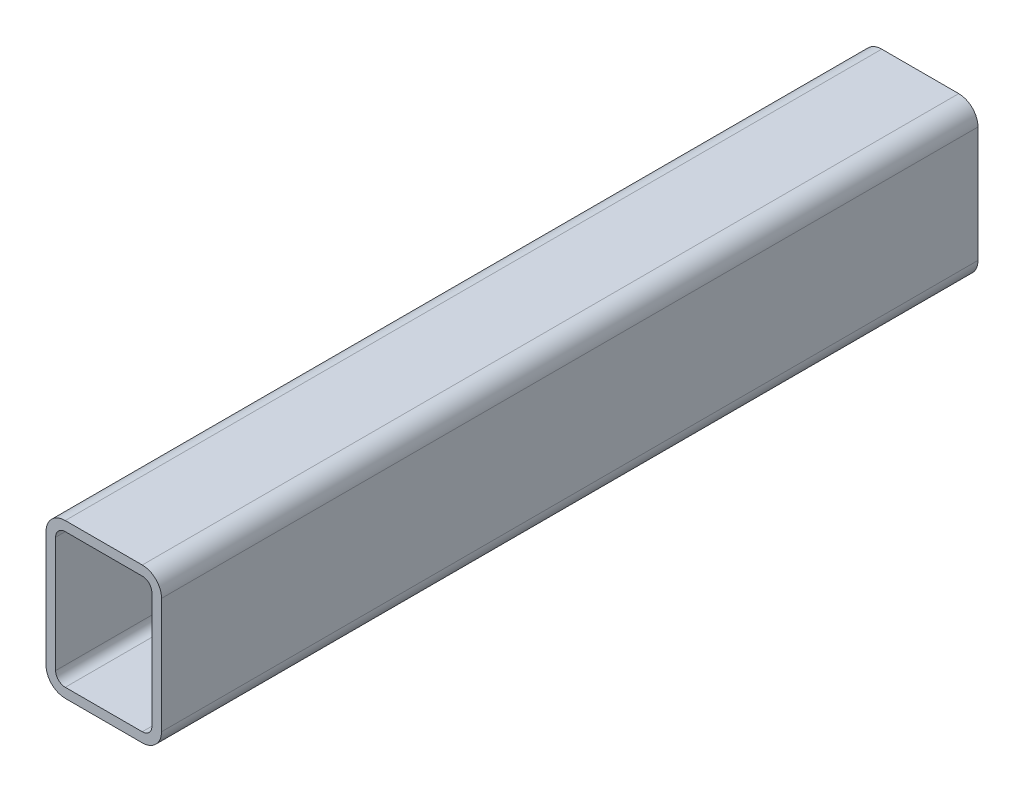
ISO-10303-21;
HEADER;
FILE_DESCRIPTION(('STEP AP214'),'2;1');
FILE_NAME('part.step','',(''),(''),'','','');
FILE_SCHEMA(('AUTOMOTIVE_DESIGN { 1 0 10303 214 1 1 1 1 }'));
ENDSEC;
DATA;
#1=APPLICATION_CONTEXT('core data for automotive mechanical design processes');
#2=APPLICATION_PROTOCOL_DEFINITION('international standard','automotive_design',2000,#1);
#3=PRODUCT_CONTEXT('',#1,'mechanical');
#4=PRODUCT('Part','Part','',(#3));
#5=PRODUCT_RELATED_PRODUCT_CATEGORY('part','',(#4));
#6=PRODUCT_DEFINITION_FORMATION('','',#4);
#7=PRODUCT_DEFINITION_CONTEXT('part definition',#1,'design');
#8=PRODUCT_DEFINITION('design','',#6,#7);
#9=PRODUCT_DEFINITION_SHAPE('','',#8);
#10=(LENGTH_UNIT() NAMED_UNIT(*) SI_UNIT(.MILLI.,.METRE.));
#11=(NAMED_UNIT(*) PLANE_ANGLE_UNIT() SI_UNIT($,.RADIAN.));
#12=(NAMED_UNIT(*) SI_UNIT($,.STERADIAN.) SOLID_ANGLE_UNIT());
#13=UNCERTAINTY_MEASURE_WITH_UNIT(LENGTH_MEASURE(1.E-05),#10,'distance_accuracy_value','');
#14=(GEOMETRIC_REPRESENTATION_CONTEXT(3) GLOBAL_UNCERTAINTY_ASSIGNED_CONTEXT((#13)) GLOBAL_UNIT_ASSIGNED_CONTEXT((#10,
#11,#12)) REPRESENTATION_CONTEXT('',''));
#15=CARTESIAN_POINT('',(0.,0.,0.));
#16=DIRECTION('',(0.,0.,1.));
#17=DIRECTION('',(1.,0.,0.));
#18=AXIS2_PLACEMENT_3D('',#15,#16,#17);
#19=CARTESIAN_POINT('',(-20.,-30.,212.));
#20=DIRECTION('',(0.,0.,1.));
#21=DIRECTION('',(1.,0.,0.));
#22=AXIS2_PLACEMENT_3D('',#19,#20,#21);
#23=PLANE('',#22);
#24=CARTESIAN_POINT('',(-20.,-30.,212.));
#25=DIRECTION('',(0.,0.,1.));
#26=DIRECTION('',(1.,0.,0.));
#27=AXIS2_PLACEMENT_3D('',#24,#25,#26);
#28=CIRCLE('',#27,10.);
#29=CARTESIAN_POINT('',(-30.,-30.,212.));
#30=VERTEX_POINT('',#29);
#31=CARTESIAN_POINT('',(-20.,-40.,212.));
#32=VERTEX_POINT('',#31);
#33=EDGE_CURVE('E210',#30,#32,#28,.T.);
#34=ORIENTED_EDGE('',*,*,#33,.T.);
#35=DIRECTION('',(1.,0.,0.));
#36=VECTOR('',#35,1.);
#37=CARTESIAN_POINT('',(-20.,-40.,212.));
#38=LINE('',#37,#36);
#39=CARTESIAN_POINT('',(20.,-40.,212.));
#40=VERTEX_POINT('',#39);
#41=EDGE_CURVE('E213',#32,#40,#38,.T.);
#42=ORIENTED_EDGE('',*,*,#41,.T.);
#43=CARTESIAN_POINT('',(20.,-30.,212.));
#44=DIRECTION('',(0.,0.,1.));
#45=DIRECTION('',(1.,0.,0.));
#46=AXIS2_PLACEMENT_3D('',#43,#44,#45);
#47=CIRCLE('',#46,10.);
#48=CARTESIAN_POINT('',(30.,-30.,212.));
#49=VERTEX_POINT('',#48);
#50=EDGE_CURVE('E216',#40,#49,#47,.T.);
#51=ORIENTED_EDGE('',*,*,#50,.T.);
#52=DIRECTION('',(0.,1.,0.));
#53=VECTOR('',#52,1.);
#54=CARTESIAN_POINT('',(30.,30.,212.));
#55=LINE('',#54,#53);
#56=CARTESIAN_POINT('',(30.,30.,212.));
#57=VERTEX_POINT('',#56);
#58=EDGE_CURVE('E218',#49,#57,#55,.T.);
#59=ORIENTED_EDGE('',*,*,#58,.T.);
#60=CARTESIAN_POINT('',(20.,30.,212.));
#61=DIRECTION('',(0.,0.,1.));
#62=DIRECTION('',(-1.,0.,0.));
#63=AXIS2_PLACEMENT_3D('',#60,#61,#62);
#64=CIRCLE('',#63,10.);
#65=CARTESIAN_POINT('',(20.,40.,212.));
#66=VERTEX_POINT('',#65);
#67=EDGE_CURVE('E220',#57,#66,#64,.T.);
#68=ORIENTED_EDGE('',*,*,#67,.T.);
#69=DIRECTION('',(-1.,0.,0.));
#70=VECTOR('',#69,1.);
#71=CARTESIAN_POINT('',(-20.,40.,212.));
#72=LINE('',#71,#70);
#73=CARTESIAN_POINT('',(-20.,40.,212.));
#74=VERTEX_POINT('',#73);
#75=EDGE_CURVE('E222',#66,#74,#72,.T.);
#76=ORIENTED_EDGE('',*,*,#75,.T.);
#77=CARTESIAN_POINT('',(-20.,30.,212.));
#78=DIRECTION('',(0.,0.,1.));
#79=DIRECTION('',(1.,0.,0.));
#80=AXIS2_PLACEMENT_3D('',#77,#78,#79);
#81=CIRCLE('',#80,10.);
#82=CARTESIAN_POINT('',(-30.,30.,212.));
#83=VERTEX_POINT('',#82);
#84=EDGE_CURVE('E224',#74,#83,#81,.T.);
#85=ORIENTED_EDGE('',*,*,#84,.T.);
#86=DIRECTION('',(0.,-1.,0.));
#87=VECTOR('',#86,1.);
#88=CARTESIAN_POINT('',(-30.,30.,212.));
#89=LINE('',#88,#87);
#90=EDGE_CURVE('E226',#83,#30,#89,.T.);
#91=ORIENTED_EDGE('',*,*,#90,.T.);
#92=EDGE_LOOP('',(#34,#42,#51,#59,#68,#76,#85,#91));
#93=FACE_BOUND('',#92,.T.);
#94=DIRECTION('',(1.,0.,0.));
#95=VECTOR('',#94,1.);
#96=CARTESIAN_POINT('',(-20.,-35.,212.));
#97=LINE('',#96,#95);
#98=CARTESIAN_POINT('',(-20.,-35.,212.));
#99=VERTEX_POINT('',#98);
#100=CARTESIAN_POINT('',(20.,-35.,212.));
#101=VERTEX_POINT('',#100);
#102=EDGE_CURVE('E153',#99,#101,#97,.T.);
#103=ORIENTED_EDGE('',*,*,#102,.F.);
#104=CARTESIAN_POINT('',(-20.,-30.,212.));
#105=DIRECTION('',(0.,0.,1.));
#106=DIRECTION('',(-1.,0.,0.));
#107=AXIS2_PLACEMENT_3D('',#104,#105,#106);
#108=CIRCLE('',#107,4.99999999999998);
#109=CARTESIAN_POINT('',(-25.,-30.,212.));
#110=VERTEX_POINT('',#109);
#111=EDGE_CURVE('E145',#110,#99,#108,.T.);
#112=ORIENTED_EDGE('',*,*,#111,.F.);
#113=DIRECTION('',(0.,-1.,0.));
#114=VECTOR('',#113,1.);
#115=CARTESIAN_POINT('',(-25.,30.,212.));
#116=LINE('',#115,#114);
#117=CARTESIAN_POINT('',(-25.,30.,212.));
#118=VERTEX_POINT('',#117);
#119=EDGE_CURVE('E178',#118,#110,#116,.T.);
#120=ORIENTED_EDGE('',*,*,#119,.F.);
#121=CARTESIAN_POINT('',(-20.,30.,212.));
#122=DIRECTION('',(0.,0.,1.));
#123=DIRECTION('',(1.,0.,0.));
#124=AXIS2_PLACEMENT_3D('',#121,#122,#123);
#125=CIRCLE('',#124,4.99999999999997);
#126=CARTESIAN_POINT('',(-20.,35.,212.));
#127=VERTEX_POINT('',#126);
#128=EDGE_CURVE('E176',#127,#118,#125,.T.);
#129=ORIENTED_EDGE('',*,*,#128,.F.);
#130=DIRECTION('',(-1.,0.,0.));
#131=VECTOR('',#130,1.);
#132=CARTESIAN_POINT('',(-20.,35.,212.));
#133=LINE('',#132,#131);
#134=CARTESIAN_POINT('',(20.,35.,212.));
#135=VERTEX_POINT('',#134);
#136=EDGE_CURVE('E174',#135,#127,#133,.T.);
#137=ORIENTED_EDGE('',*,*,#136,.F.);
#138=CARTESIAN_POINT('',(20.,30.,212.));
#139=DIRECTION('',(0.,0.,1.));
#140=DIRECTION('',(-1.,0.,0.));
#141=AXIS2_PLACEMENT_3D('',#138,#139,#140);
#142=CIRCLE('',#141,4.99999999999998);
#143=CARTESIAN_POINT('',(25.,30.,212.));
#144=VERTEX_POINT('',#143);
#145=EDGE_CURVE('E172',#144,#135,#142,.T.);
#146=ORIENTED_EDGE('',*,*,#145,.F.);
#147=DIRECTION('',(0.,1.,0.));
#148=VECTOR('',#147,1.);
#149=CARTESIAN_POINT('',(25.,30.,212.));
#150=LINE('',#149,#148);
#151=CARTESIAN_POINT('',(25.,-30.,212.));
#152=VERTEX_POINT('',#151);
#153=EDGE_CURVE('E168',#152,#144,#150,.T.);
#154=ORIENTED_EDGE('',*,*,#153,.F.);
#155=CARTESIAN_POINT('',(20.,-30.,212.));
#156=DIRECTION('',(0.,0.,1.));
#157=DIRECTION('',(-1.,0.,0.));
#158=AXIS2_PLACEMENT_3D('',#155,#156,#157);
#159=CIRCLE('',#158,4.99999999999998);
#160=EDGE_CURVE('E166',#101,#152,#159,.T.);
#161=ORIENTED_EDGE('',*,*,#160,.F.);
#162=EDGE_LOOP('',(#103,#112,#120,#129,#137,#146,#154,#161));
#163=FACE_BOUND('',#162,.T.);
#164=ADVANCED_FACE('F32',(#93,#163),#23,.T.);
#165=CARTESIAN_POINT('',(-20.,-30.,-212.));
#166=DIRECTION('',(0.,0.,1.));
#167=DIRECTION('',(1.,0.,0.));
#168=AXIS2_PLACEMENT_3D('',#165,#166,#167);
#169=PLANE('',#168);
#170=CARTESIAN_POINT('',(-20.,-30.,-212.));
#171=DIRECTION('',(0.,0.,1.));
#172=DIRECTION('',(1.,0.,0.));
#173=AXIS2_PLACEMENT_3D('',#170,#171,#172);
#174=CIRCLE('',#173,10.);
#175=CARTESIAN_POINT('',(-30.,-30.,-212.));
#176=VERTEX_POINT('',#175);
#177=CARTESIAN_POINT('',(-20.,-40.,-212.));
#178=VERTEX_POINT('',#177);
#179=EDGE_CURVE('E161',#176,#178,#174,.T.);
#180=ORIENTED_EDGE('',*,*,#179,.F.);
#181=DIRECTION('',(0.,-1.,0.));
#182=VECTOR('',#181,1.);
#183=CARTESIAN_POINT('',(-30.,30.,-212.));
#184=LINE('',#183,#182);
#185=CARTESIAN_POINT('',(-30.,30.,-212.));
#186=VERTEX_POINT('',#185);
#187=EDGE_CURVE('E214',#186,#176,#184,.T.);
#188=ORIENTED_EDGE('',*,*,#187,.F.);
#189=CARTESIAN_POINT('',(-20.,30.,-212.));
#190=DIRECTION('',(0.,0.,1.));
#191=DIRECTION('',(1.,0.,0.));
#192=AXIS2_PLACEMENT_3D('',#189,#190,#191);
#193=CIRCLE('',#192,10.);
#194=CARTESIAN_POINT('',(-20.,40.,-212.));
#195=VERTEX_POINT('',#194);
#196=EDGE_CURVE('E241',#195,#186,#193,.T.);
#197=ORIENTED_EDGE('',*,*,#196,.F.);
#198=DIRECTION('',(-1.,0.,0.));
#199=VECTOR('',#198,1.);
#200=CARTESIAN_POINT('',(-20.,40.,-212.));
#201=LINE('',#200,#199);
#202=CARTESIAN_POINT('',(20.,40.,-212.));
#203=VERTEX_POINT('',#202);
#204=EDGE_CURVE('E239',#203,#195,#201,.T.);
#205=ORIENTED_EDGE('',*,*,#204,.F.);
#206=CARTESIAN_POINT('',(20.,30.,-212.));
#207=DIRECTION('',(0.,0.,1.));
#208=DIRECTION('',(-1.,0.,0.));
#209=AXIS2_PLACEMENT_3D('',#206,#207,#208);
#210=CIRCLE('',#209,10.);
#211=CARTESIAN_POINT('',(30.,30.,-212.));
#212=VERTEX_POINT('',#211);
#213=EDGE_CURVE('E237',#212,#203,#210,.T.);
#214=ORIENTED_EDGE('',*,*,#213,.F.);
#215=DIRECTION('',(0.,1.,0.));
#216=VECTOR('',#215,1.);
#217=CARTESIAN_POINT('',(30.,30.,-212.));
#218=LINE('',#217,#216);
#219=CARTESIAN_POINT('',(30.,-30.,-212.));
#220=VERTEX_POINT('',#219);
#221=EDGE_CURVE('E235',#220,#212,#218,.T.);
#222=ORIENTED_EDGE('',*,*,#221,.F.);
#223=CARTESIAN_POINT('',(20.,-30.,-212.));
#224=DIRECTION('',(0.,0.,1.));
#225=DIRECTION('',(1.,0.,0.));
#226=AXIS2_PLACEMENT_3D('',#223,#224,#225);
#227=CIRCLE('',#226,10.);
#228=CARTESIAN_POINT('',(20.,-40.,-212.));
#229=VERTEX_POINT('',#228);
#230=EDGE_CURVE('E233',#229,#220,#227,.T.);
#231=ORIENTED_EDGE('',*,*,#230,.F.);
#232=DIRECTION('',(1.,0.,0.));
#233=VECTOR('',#232,1.);
#234=CARTESIAN_POINT('',(-20.,-40.,-212.));
#235=LINE('',#234,#233);
#236=EDGE_CURVE('E231',#178,#229,#235,.T.);
#237=ORIENTED_EDGE('',*,*,#236,.F.);
#238=EDGE_LOOP('',(#180,#188,#197,#205,#214,#222,#231,#237));
#239=FACE_BOUND('',#238,.T.);
#240=CARTESIAN_POINT('',(-20.,-30.,-212.));
#241=DIRECTION('',(0.,0.,1.));
#242=DIRECTION('',(-1.,0.,0.));
#243=AXIS2_PLACEMENT_3D('',#240,#241,#242);
#244=CIRCLE('',#243,4.99999999999998);
#245=CARTESIAN_POINT('',(-25.,-30.,-212.));
#246=VERTEX_POINT('',#245);
#247=CARTESIAN_POINT('',(-20.,-35.,-212.));
#248=VERTEX_POINT('',#247);
#249=EDGE_CURVE('E55',#246,#248,#244,.T.);
#250=ORIENTED_EDGE('',*,*,#249,.T.);
#251=DIRECTION('',(1.,0.,0.));
#252=VECTOR('',#251,1.);
#253=CARTESIAN_POINT('',(-20.,-35.,-212.));
#254=LINE('',#253,#252);
#255=CARTESIAN_POINT('',(20.,-35.,-212.));
#256=VERTEX_POINT('',#255);
#257=EDGE_CURVE('E160',#248,#256,#254,.T.);
#258=ORIENTED_EDGE('',*,*,#257,.T.);
#259=CARTESIAN_POINT('',(20.,-30.,-212.));
#260=DIRECTION('',(0.,0.,1.));
#261=DIRECTION('',(-1.,0.,0.));
#262=AXIS2_PLACEMENT_3D('',#259,#260,#261);
#263=CIRCLE('',#262,4.99999999999998);
#264=CARTESIAN_POINT('',(25.,-30.,-212.));
#265=VERTEX_POINT('',#264);
#266=EDGE_CURVE('E182',#256,#265,#263,.T.);
#267=ORIENTED_EDGE('',*,*,#266,.T.);
#268=DIRECTION('',(0.,1.,0.));
#269=VECTOR('',#268,1.);
#270=CARTESIAN_POINT('',(25.,30.,-212.));
#271=LINE('',#270,#269);
#272=CARTESIAN_POINT('',(25.,30.,-212.));
#273=VERTEX_POINT('',#272);
#274=EDGE_CURVE('E185',#265,#273,#271,.T.);
#275=ORIENTED_EDGE('',*,*,#274,.T.);
#276=CARTESIAN_POINT('',(20.,30.,-212.));
#277=DIRECTION('',(0.,0.,1.));
#278=DIRECTION('',(-1.,0.,0.));
#279=AXIS2_PLACEMENT_3D('',#276,#277,#278);
#280=CIRCLE('',#279,4.99999999999998);
#281=CARTESIAN_POINT('',(20.,35.,-212.));
#282=VERTEX_POINT('',#281);
#283=EDGE_CURVE('E188',#273,#282,#280,.T.);
#284=ORIENTED_EDGE('',*,*,#283,.T.);
#285=DIRECTION('',(-1.,0.,0.));
#286=VECTOR('',#285,1.);
#287=CARTESIAN_POINT('',(-20.,35.,-212.));
#288=LINE('',#287,#286);
#289=CARTESIAN_POINT('',(-20.,35.,-212.));
#290=VERTEX_POINT('',#289);
#291=EDGE_CURVE('E191',#282,#290,#288,.T.);
#292=ORIENTED_EDGE('',*,*,#291,.T.);
#293=CARTESIAN_POINT('',(-20.,30.,-212.));
#294=DIRECTION('',(0.,0.,1.));
#295=DIRECTION('',(1.,0.,0.));
#296=AXIS2_PLACEMENT_3D('',#293,#294,#295);
#297=CIRCLE('',#296,4.99999999999997);
#298=CARTESIAN_POINT('',(-25.,30.,-212.));
#299=VERTEX_POINT('',#298);
#300=EDGE_CURVE('E194',#290,#299,#297,.T.);
#301=ORIENTED_EDGE('',*,*,#300,.T.);
#302=DIRECTION('',(0.,-1.,0.));
#303=VECTOR('',#302,1.);
#304=CARTESIAN_POINT('',(-25.,30.,-212.));
#305=LINE('',#304,#303);
#306=EDGE_CURVE('E154',#299,#246,#305,.T.);
#307=ORIENTED_EDGE('',*,*,#306,.T.);
#308=EDGE_LOOP('',(#250,#258,#267,#275,#284,#292,#301,#307));
#309=FACE_BOUND('',#308,.T.);
#310=ADVANCED_FACE('F271',(#239,#309),#169,.F.);
#311=CARTESIAN_POINT('',(-20.,-30.,212.));
#312=DIRECTION('',(0.,0.,-1.));
#313=DIRECTION('',(-1.,0.,0.));
#314=AXIS2_PLACEMENT_3D('',#311,#312,#313);
#315=CYLINDRICAL_SURFACE('',#314,10.);
#316=ORIENTED_EDGE('',*,*,#179,.T.);
#317=DIRECTION('',(0.,0.,-1.));
#318=VECTOR('',#317,1.);
#319=CARTESIAN_POINT('',(-20.,-40.,212.));
#320=LINE('',#319,#318);
#321=EDGE_CURVE('E11',#32,#178,#320,.T.);
#322=ORIENTED_EDGE('',*,*,#321,.F.);
#323=ORIENTED_EDGE('',*,*,#33,.F.);
#324=DIRECTION('',(0.,0.,-1.));
#325=VECTOR('',#324,1.);
#326=CARTESIAN_POINT('',(-30.,-30.,212.));
#327=LINE('',#326,#325);
#328=EDGE_CURVE('E228',#30,#176,#327,.T.);
#329=ORIENTED_EDGE('',*,*,#328,.T.);
#330=EDGE_LOOP('',(#316,#322,#323,#329));
#331=FACE_BOUND('',#330,.T.);
#332=ADVANCED_FACE('F34',(#331),#315,.T.);
#333=CARTESIAN_POINT('',(-20.,-40.,212.));
#334=DIRECTION('',(0.,1.,0.));
#335=DIRECTION('',(-1.,0.,0.));
#336=AXIS2_PLACEMENT_3D('',#333,#334,#335);
#337=PLANE('',#336);
#338=ORIENTED_EDGE('',*,*,#236,.T.);
#339=DIRECTION('',(0.,0.,-1.));
#340=VECTOR('',#339,1.);
#341=CARTESIAN_POINT('',(20.,-40.,212.));
#342=LINE('',#341,#340);
#343=EDGE_CURVE('E40',#40,#229,#342,.T.);
#344=ORIENTED_EDGE('',*,*,#343,.F.);
#345=ORIENTED_EDGE('',*,*,#41,.F.);
#346=ORIENTED_EDGE('',*,*,#321,.T.);
#347=EDGE_LOOP('',(#338,#344,#345,#346));
#348=FACE_BOUND('',#347,.T.);
#349=ADVANCED_FACE('F288',(#348),#337,.F.);
#350=CARTESIAN_POINT('',(20.,-30.,212.));
#351=DIRECTION('',(0.,0.,-1.));
#352=DIRECTION('',(-1.,0.,0.));
#353=AXIS2_PLACEMENT_3D('',#350,#351,#352);
#354=CYLINDRICAL_SURFACE('',#353,10.);
#355=ORIENTED_EDGE('',*,*,#230,.T.);
#356=DIRECTION('',(0.,0.,-1.));
#357=VECTOR('',#356,1.);
#358=CARTESIAN_POINT('',(30.,-30.,212.));
#359=LINE('',#358,#357);
#360=EDGE_CURVE('E258',#49,#220,#359,.T.);
#361=ORIENTED_EDGE('',*,*,#360,.F.);
#362=ORIENTED_EDGE('',*,*,#50,.F.);
#363=ORIENTED_EDGE('',*,*,#343,.T.);
#364=EDGE_LOOP('',(#355,#361,#362,#363));
#365=FACE_BOUND('',#364,.T.);
#366=ADVANCED_FACE('F265',(#365),#354,.T.);
#367=CARTESIAN_POINT('',(30.,30.,212.));
#368=DIRECTION('',(-1.,0.,0.));
#369=DIRECTION('',(0.,0.,1.));
#370=AXIS2_PLACEMENT_3D('',#367,#368,#369);
#371=PLANE('',#370);
#372=ORIENTED_EDGE('',*,*,#221,.T.);
#373=DIRECTION('',(0.,0.,-1.));
#374=VECTOR('',#373,1.);
#375=CARTESIAN_POINT('',(30.,30.,212.));
#376=LINE('',#375,#374);
#377=EDGE_CURVE('E255',#57,#212,#376,.T.);
#378=ORIENTED_EDGE('',*,*,#377,.F.);
#379=ORIENTED_EDGE('',*,*,#58,.F.);
#380=ORIENTED_EDGE('',*,*,#360,.T.);
#381=EDGE_LOOP('',(#372,#378,#379,#380));
#382=FACE_BOUND('',#381,.T.);
#383=ADVANCED_FACE('F277',(#382),#371,.F.);
#384=CARTESIAN_POINT('',(20.,30.,212.));
#385=DIRECTION('',(0.,0.,-1.));
#386=DIRECTION('',(-1.,0.,0.));
#387=AXIS2_PLACEMENT_3D('',#384,#385,#386);
#388=CYLINDRICAL_SURFACE('',#387,10.);
#389=ORIENTED_EDGE('',*,*,#213,.T.);
#390=DIRECTION('',(0.,0.,-1.));
#391=VECTOR('',#390,1.);
#392=CARTESIAN_POINT('',(20.,40.,212.));
#393=LINE('',#392,#391);
#394=EDGE_CURVE('E252',#66,#203,#393,.T.);
#395=ORIENTED_EDGE('',*,*,#394,.F.);
#396=ORIENTED_EDGE('',*,*,#67,.F.);
#397=ORIENTED_EDGE('',*,*,#377,.T.);
#398=EDGE_LOOP('',(#389,#395,#396,#397));
#399=FACE_BOUND('',#398,.T.);
#400=ADVANCED_FACE('F281',(#399),#388,.T.);
#401=CARTESIAN_POINT('',(-20.,40.,212.));
#402=DIRECTION('',(0.,-1.,0.));
#403=DIRECTION('',(1.,0.,0.));
#404=AXIS2_PLACEMENT_3D('',#401,#402,#403);
#405=PLANE('',#404);
#406=ORIENTED_EDGE('',*,*,#204,.T.);
#407=DIRECTION('',(0.,0.,-1.));
#408=VECTOR('',#407,1.);
#409=CARTESIAN_POINT('',(-20.,40.,212.));
#410=LINE('',#409,#408);
#411=EDGE_CURVE('E249',#74,#195,#410,.T.);
#412=ORIENTED_EDGE('',*,*,#411,.F.);
#413=ORIENTED_EDGE('',*,*,#75,.F.);
#414=ORIENTED_EDGE('',*,*,#394,.T.);
#415=EDGE_LOOP('',(#406,#412,#413,#414));
#416=FACE_BOUND('',#415,.T.);
#417=ADVANCED_FACE('F301',(#416),#405,.F.);
#418=CARTESIAN_POINT('',(-20.,30.,212.));
#419=DIRECTION('',(0.,0.,-1.));
#420=DIRECTION('',(-1.,0.,0.));
#421=AXIS2_PLACEMENT_3D('',#418,#419,#420);
#422=CYLINDRICAL_SURFACE('',#421,10.);
#423=ORIENTED_EDGE('',*,*,#196,.T.);
#424=DIRECTION('',(0.,0.,-1.));
#425=VECTOR('',#424,1.);
#426=CARTESIAN_POINT('',(-30.,30.,212.));
#427=LINE('',#426,#425);
#428=EDGE_CURVE('E246',#83,#186,#427,.T.);
#429=ORIENTED_EDGE('',*,*,#428,.F.);
#430=ORIENTED_EDGE('',*,*,#84,.F.);
#431=ORIENTED_EDGE('',*,*,#411,.T.);
#432=EDGE_LOOP('',(#423,#429,#430,#431));
#433=FACE_BOUND('',#432,.T.);
#434=ADVANCED_FACE('F299',(#433),#422,.T.);
#435=CARTESIAN_POINT('',(-30.,30.,212.));
#436=DIRECTION('',(1.,0.,0.));
#437=DIRECTION('',(0.,1.,0.));
#438=AXIS2_PLACEMENT_3D('',#435,#436,#437);
#439=PLANE('',#438);
#440=ORIENTED_EDGE('',*,*,#187,.T.);
#441=ORIENTED_EDGE('',*,*,#328,.F.);
#442=ORIENTED_EDGE('',*,*,#90,.F.);
#443=ORIENTED_EDGE('',*,*,#428,.T.);
#444=EDGE_LOOP('',(#440,#441,#442,#443));
#445=FACE_BOUND('',#444,.T.);
#446=ADVANCED_FACE('F294',(#445),#439,.F.);
#447=CARTESIAN_POINT('',(-20.,-30.,212.));
#448=DIRECTION('',(0.,0.,-1.));
#449=DIRECTION('',(-1.,0.,0.));
#450=AXIS2_PLACEMENT_3D('',#447,#448,#449);
#451=CYLINDRICAL_SURFACE('',#450,4.99999999999998);
#452=ORIENTED_EDGE('',*,*,#249,.F.);
#453=DIRECTION('',(0.,0.,-1.));
#454=VECTOR('',#453,1.);
#455=CARTESIAN_POINT('',(-25.,-30.,212.));
#456=LINE('',#455,#454);
#457=EDGE_CURVE('E149',#110,#246,#456,.T.);
#458=ORIENTED_EDGE('',*,*,#457,.F.);
#459=ORIENTED_EDGE('',*,*,#111,.T.);
#460=DIRECTION('',(0.,0.,-1.));
#461=VECTOR('',#460,1.);
#462=CARTESIAN_POINT('',(-20.,-35.,212.));
#463=LINE('',#462,#461);
#464=EDGE_CURVE('E148',#99,#248,#463,.T.);
#465=ORIENTED_EDGE('',*,*,#464,.T.);
#466=EDGE_LOOP('',(#452,#458,#459,#465));
#467=FACE_BOUND('',#466,.T.);
#468=ADVANCED_FACE('F147',(#467),#451,.F.);
#469=CARTESIAN_POINT('',(-20.,-35.,212.));
#470=DIRECTION('',(0.,1.,0.));
#471=DIRECTION('',(-1.,0.,0.));
#472=AXIS2_PLACEMENT_3D('',#469,#470,#471);
#473=PLANE('',#472);
#474=ORIENTED_EDGE('',*,*,#257,.F.);
#475=ORIENTED_EDGE('',*,*,#464,.F.);
#476=ORIENTED_EDGE('',*,*,#102,.T.);
#477=DIRECTION('',(0.,0.,-1.));
#478=VECTOR('',#477,1.);
#479=CARTESIAN_POINT('',(20.,-35.,212.));
#480=LINE('',#479,#478);
#481=EDGE_CURVE('E162',#101,#256,#480,.T.);
#482=ORIENTED_EDGE('',*,*,#481,.T.);
#483=EDGE_LOOP('',(#474,#475,#476,#482));
#484=FACE_BOUND('',#483,.T.);
#485=ADVANCED_FACE('F157',(#484),#473,.T.);
#486=CARTESIAN_POINT('',(20.,-30.,212.));
#487=DIRECTION('',(0.,0.,-1.));
#488=DIRECTION('',(-1.,0.,0.));
#489=AXIS2_PLACEMENT_3D('',#486,#487,#488);
#490=CYLINDRICAL_SURFACE('',#489,4.99999999999998);
#491=ORIENTED_EDGE('',*,*,#266,.F.);
#492=ORIENTED_EDGE('',*,*,#481,.F.);
#493=ORIENTED_EDGE('',*,*,#160,.T.);
#494=DIRECTION('',(0.,0.,-1.));
#495=VECTOR('',#494,1.);
#496=CARTESIAN_POINT('',(25.,-30.,212.));
#497=LINE('',#496,#495);
#498=EDGE_CURVE('E207',#152,#265,#497,.T.);
#499=ORIENTED_EDGE('',*,*,#498,.T.);
#500=EDGE_LOOP('',(#491,#492,#493,#499));
#501=FACE_BOUND('',#500,.T.);
#502=ADVANCED_FACE('F326',(#501),#490,.F.);
#503=CARTESIAN_POINT('',(25.,30.,212.));
#504=DIRECTION('',(-1.,0.,0.));
#505=DIRECTION('',(0.,0.,1.));
#506=AXIS2_PLACEMENT_3D('',#503,#504,#505);
#507=PLANE('',#506);
#508=ORIENTED_EDGE('',*,*,#274,.F.);
#509=ORIENTED_EDGE('',*,*,#498,.F.);
#510=ORIENTED_EDGE('',*,*,#153,.T.);
#511=DIRECTION('',(0.,0.,-1.));
#512=VECTOR('',#511,1.);
#513=CARTESIAN_POINT('',(25.,30.,212.));
#514=LINE('',#513,#512);
#515=EDGE_CURVE('E205',#144,#273,#514,.T.);
#516=ORIENTED_EDGE('',*,*,#515,.T.);
#517=EDGE_LOOP('',(#508,#509,#510,#516));
#518=FACE_BOUND('',#517,.T.);
#519=ADVANCED_FACE('F330',(#518),#507,.T.);
#520=CARTESIAN_POINT('',(20.,30.,212.));
#521=DIRECTION('',(0.,0.,-1.));
#522=DIRECTION('',(-1.,0.,0.));
#523=AXIS2_PLACEMENT_3D('',#520,#521,#522);
#524=CYLINDRICAL_SURFACE('',#523,4.99999999999998);
#525=ORIENTED_EDGE('',*,*,#283,.F.);
#526=ORIENTED_EDGE('',*,*,#515,.F.);
#527=ORIENTED_EDGE('',*,*,#145,.T.);
#528=DIRECTION('',(0.,0.,-1.));
#529=VECTOR('',#528,1.);
#530=CARTESIAN_POINT('',(20.,35.,212.));
#531=LINE('',#530,#529);
#532=EDGE_CURVE('E203',#135,#282,#531,.T.);
#533=ORIENTED_EDGE('',*,*,#532,.T.);
#534=EDGE_LOOP('',(#525,#526,#527,#533));
#535=FACE_BOUND('',#534,.T.);
#536=ADVANCED_FACE('F336',(#535),#524,.F.);
#537=CARTESIAN_POINT('',(-20.,35.,212.));
#538=DIRECTION('',(0.,-1.,0.));
#539=DIRECTION('',(1.,0.,0.));
#540=AXIS2_PLACEMENT_3D('',#537,#538,#539);
#541=PLANE('',#540);
#542=ORIENTED_EDGE('',*,*,#291,.F.);
#543=ORIENTED_EDGE('',*,*,#532,.F.);
#544=ORIENTED_EDGE('',*,*,#136,.T.);
#545=DIRECTION('',(0.,0.,-1.));
#546=VECTOR('',#545,1.);
#547=CARTESIAN_POINT('',(-20.,35.,212.));
#548=LINE('',#547,#546);
#549=EDGE_CURVE('E201',#127,#290,#548,.T.);
#550=ORIENTED_EDGE('',*,*,#549,.T.);
#551=EDGE_LOOP('',(#542,#543,#544,#550));
#552=FACE_BOUND('',#551,.T.);
#553=ADVANCED_FACE('F340',(#552),#541,.T.);
#554=CARTESIAN_POINT('',(-20.,30.,212.));
#555=DIRECTION('',(0.,0.,-1.));
#556=DIRECTION('',(-1.,0.,0.));
#557=AXIS2_PLACEMENT_3D('',#554,#555,#556);
#558=CYLINDRICAL_SURFACE('',#557,4.99999999999997);
#559=ORIENTED_EDGE('',*,*,#300,.F.);
#560=ORIENTED_EDGE('',*,*,#549,.F.);
#561=ORIENTED_EDGE('',*,*,#128,.T.);
#562=DIRECTION('',(0.,0.,-1.));
#563=VECTOR('',#562,1.);
#564=CARTESIAN_POINT('',(-25.,30.,212.));
#565=LINE('',#564,#563);
#566=EDGE_CURVE('E47',#118,#299,#565,.T.);
#567=ORIENTED_EDGE('',*,*,#566,.T.);
#568=EDGE_LOOP('',(#559,#560,#561,#567));
#569=FACE_BOUND('',#568,.T.);
#570=ADVANCED_FACE('F344',(#569),#558,.F.);
#571=CARTESIAN_POINT('',(-25.,30.,212.));
#572=DIRECTION('',(1.,0.,0.));
#573=DIRECTION('',(0.,1.,0.));
#574=AXIS2_PLACEMENT_3D('',#571,#572,#573);
#575=PLANE('',#574);
#576=ORIENTED_EDGE('',*,*,#306,.F.);
#577=ORIENTED_EDGE('',*,*,#566,.F.);
#578=ORIENTED_EDGE('',*,*,#119,.T.);
#579=ORIENTED_EDGE('',*,*,#457,.T.);
#580=EDGE_LOOP('',(#576,#577,#578,#579));
#581=FACE_BOUND('',#580,.T.);
#582=ADVANCED_FACE('F348',(#581),#575,.T.);
#583=CLOSED_SHELL('',(#164,#310,#332,#349,#366,#383,#400,#417,#434,#446,#468,#485,#502,#519,
#536,#553,#570,#582));
#584=MANIFOLD_SOLID_BREP('B2',#583);
#585=ADVANCED_BREP_SHAPE_REPRESENTATION('',(#18,#584),#14);
#586=SHAPE_DEFINITION_REPRESENTATION(#9,#585);
ENDSEC;
END-ISO-10303-21;
